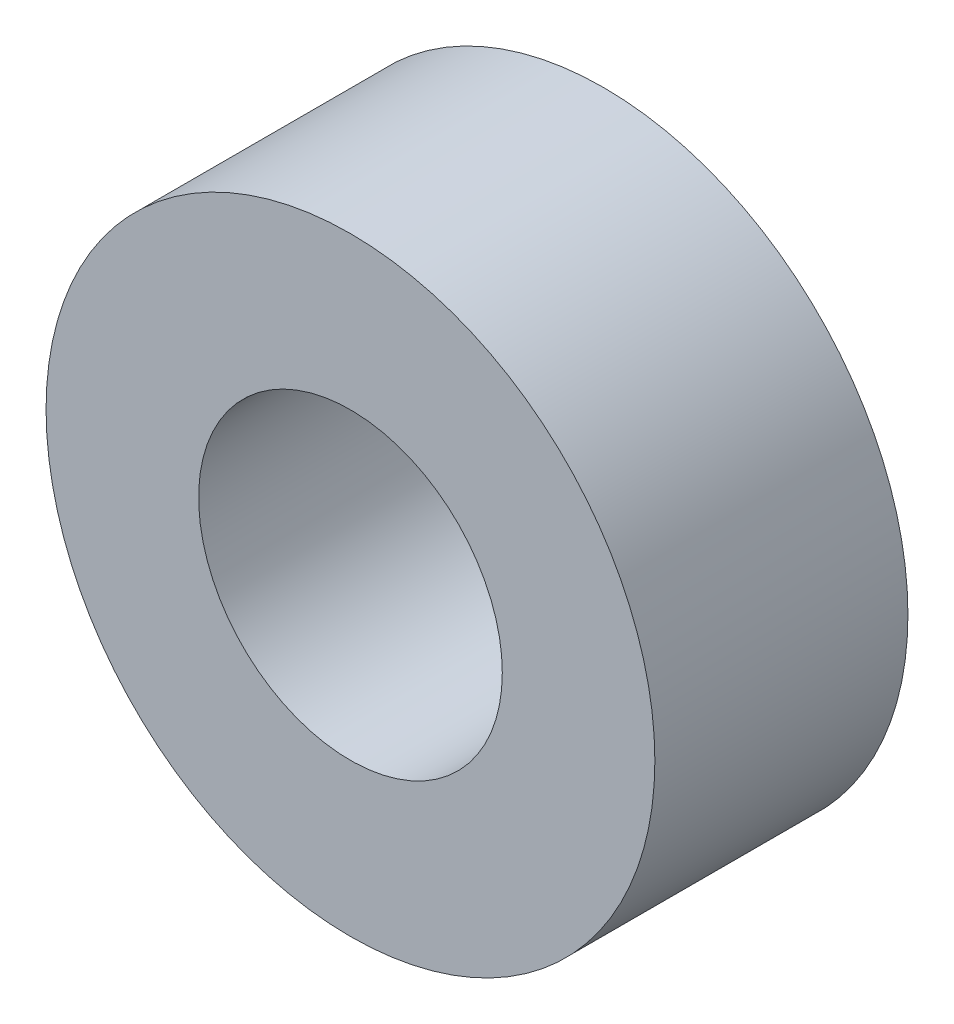
ISO-10303-21;
HEADER;
FILE_DESCRIPTION(('STEP AP214'),'2;1');
FILE_NAME('part.step','',(''),(''),'','','');
FILE_SCHEMA(('AUTOMOTIVE_DESIGN { 1 0 10303 214 1 1 1 1 }'));
ENDSEC;
DATA;
#1=APPLICATION_CONTEXT('core data for automotive mechanical design processes');
#2=APPLICATION_PROTOCOL_DEFINITION('international standard','automotive_design',2000,#1);
#3=PRODUCT_CONTEXT('',#1,'mechanical');
#4=PRODUCT('Part','Part','',(#3));
#5=PRODUCT_RELATED_PRODUCT_CATEGORY('part','',(#4));
#6=PRODUCT_DEFINITION_FORMATION('','',#4);
#7=PRODUCT_DEFINITION_CONTEXT('part definition',#1,'design');
#8=PRODUCT_DEFINITION('design','',#6,#7);
#9=PRODUCT_DEFINITION_SHAPE('','',#8);
#10=(LENGTH_UNIT() NAMED_UNIT(*) SI_UNIT(.MILLI.,.METRE.));
#11=(NAMED_UNIT(*) PLANE_ANGLE_UNIT() SI_UNIT($,.RADIAN.));
#12=(NAMED_UNIT(*) SI_UNIT($,.STERADIAN.) SOLID_ANGLE_UNIT());
#13=UNCERTAINTY_MEASURE_WITH_UNIT(LENGTH_MEASURE(1.E-05),#10,'distance_accuracy_value','');
#14=(GEOMETRIC_REPRESENTATION_CONTEXT(3) GLOBAL_UNCERTAINTY_ASSIGNED_CONTEXT((#13)) GLOBAL_UNIT_ASSIGNED_CONTEXT((#10,
#11,#12)) REPRESENTATION_CONTEXT('',''));
#15=CARTESIAN_POINT('',(0.,0.,0.));
#16=DIRECTION('',(0.,0.,1.));
#17=DIRECTION('',(1.,0.,0.));
#18=AXIS2_PLACEMENT_3D('',#15,#16,#17);
#19=CARTESIAN_POINT('',(0.,0.,2.5));
#20=DIRECTION('',(0.,0.,1.));
#21=DIRECTION('',(1.,0.,0.));
#22=AXIS2_PLACEMENT_3D('',#19,#20,#21);
#23=PLANE('',#22);
#24=CARTESIAN_POINT('',(0.,0.,2.5));
#25=DIRECTION('',(0.,0.,1.));
#26=DIRECTION('',(1.,0.,0.));
#27=AXIS2_PLACEMENT_3D('',#24,#25,#26);
#28=CIRCLE('',#27,3.00709507390758);
#29=CARTESIAN_POINT('',(3.00709507390758,0.,2.5));
#30=VERTEX_POINT('',#29);
#31=EDGE_CURVE('E10',#30,#30,#28,.T.);
#32=ORIENTED_EDGE('',*,*,#31,.T.);
#33=EDGE_LOOP('',(#32));
#34=FACE_BOUND('',#33,.T.);
#35=CARTESIAN_POINT('',(0.,0.,2.5));
#36=DIRECTION('',(0.,0.,1.));
#37=DIRECTION('',(1.,0.,0.));
#38=AXIS2_PLACEMENT_3D('',#35,#36,#37);
#39=CIRCLE('',#38,1.5);
#40=CARTESIAN_POINT('',(1.5,0.,2.5));
#41=VERTEX_POINT('',#40);
#42=EDGE_CURVE('E43',#41,#41,#39,.T.);
#43=ORIENTED_EDGE('',*,*,#42,.F.);
#44=EDGE_LOOP('',(#43));
#45=FACE_BOUND('',#44,.T.);
#46=ADVANCED_FACE('F32',(#34,#45),#23,.T.);
#47=CARTESIAN_POINT('',(0.,0.,0.));
#48=DIRECTION('',(0.,0.,1.));
#49=DIRECTION('',(1.,0.,0.));
#50=AXIS2_PLACEMENT_3D('',#47,#48,#49);
#51=PLANE('',#50);
#52=CARTESIAN_POINT('',(0.,0.,0.));
#53=DIRECTION('',(0.,0.,1.));
#54=DIRECTION('',(1.,0.,0.));
#55=AXIS2_PLACEMENT_3D('',#52,#53,#54);
#56=CIRCLE('',#55,3.00709507390758);
#57=CARTESIAN_POINT('',(3.00709507390758,0.,0.));
#58=VERTEX_POINT('',#57);
#59=EDGE_CURVE('E36',#58,#58,#56,.T.);
#60=ORIENTED_EDGE('',*,*,#59,.F.);
#61=EDGE_LOOP('',(#60));
#62=FACE_BOUND('',#61,.T.);
#63=CARTESIAN_POINT('',(0.,0.,0.));
#64=DIRECTION('',(0.,0.,1.));
#65=DIRECTION('',(1.,0.,0.));
#66=AXIS2_PLACEMENT_3D('',#63,#64,#65);
#67=CIRCLE('',#66,1.5);
#68=CARTESIAN_POINT('',(1.5,0.,0.));
#69=VERTEX_POINT('',#68);
#70=EDGE_CURVE('E45',#69,#69,#67,.T.);
#71=ORIENTED_EDGE('',*,*,#70,.T.);
#72=EDGE_LOOP('',(#71));
#73=FACE_BOUND('',#72,.T.);
#74=ADVANCED_FACE('F55',(#62,#73),#51,.F.);
#75=CARTESIAN_POINT('',(0.,0.,2.5));
#76=DIRECTION('',(0.,0.,-1.));
#77=DIRECTION('',(-1.,0.,0.));
#78=AXIS2_PLACEMENT_3D('',#75,#76,#77);
#79=CYLINDRICAL_SURFACE('',#78,3.00709507390758);
#80=ORIENTED_EDGE('',*,*,#31,.F.);
#81=EDGE_LOOP('',(#80));
#82=FACE_BOUND('',#81,.T.);
#83=ORIENTED_EDGE('',*,*,#59,.T.);
#84=EDGE_LOOP('',(#83));
#85=FACE_BOUND('',#84,.T.);
#86=ADVANCED_FACE('F34',(#82,#85),#79,.T.);
#87=CARTESIAN_POINT('',(0.,0.,2.5));
#88=DIRECTION('',(0.,0.,-1.));
#89=DIRECTION('',(-1.,0.,0.));
#90=AXIS2_PLACEMENT_3D('',#87,#88,#89);
#91=CYLINDRICAL_SURFACE('',#90,1.5);
#92=ORIENTED_EDGE('',*,*,#42,.T.);
#93=EDGE_LOOP('',(#92));
#94=FACE_BOUND('',#93,.T.);
#95=ORIENTED_EDGE('',*,*,#70,.F.);
#96=EDGE_LOOP('',(#95));
#97=FACE_BOUND('',#96,.T.);
#98=ADVANCED_FACE('F51',(#94,#97),#91,.F.);
#99=CLOSED_SHELL('',(#46,#74,#86,#98));
#100=MANIFOLD_SOLID_BREP('B2',#99);
#101=ADVANCED_BREP_SHAPE_REPRESENTATION('',(#18,#100),#14);
#102=SHAPE_DEFINITION_REPRESENTATION(#9,#101);
ENDSEC;
END-ISO-10303-21;
